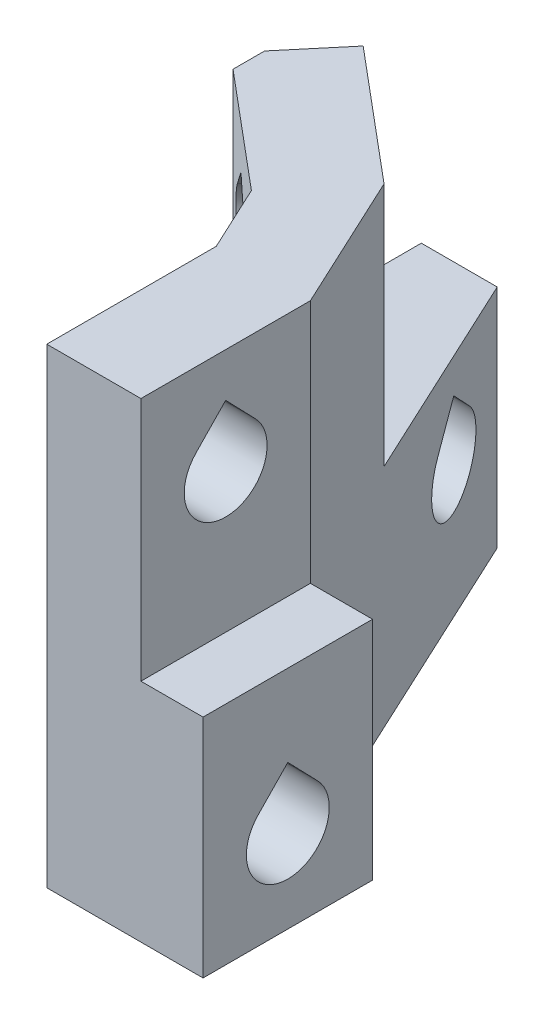
ISO-10303-21;
HEADER;
FILE_DESCRIPTION(('STEP AP214'),'2;1');
FILE_NAME('part.step','',(''),(''),'','','');
FILE_SCHEMA(('AUTOMOTIVE_DESIGN { 1 0 10303 214 1 1 1 1 }'));
ENDSEC;
DATA;
#1=APPLICATION_CONTEXT('core data for automotive mechanical design processes');
#2=APPLICATION_PROTOCOL_DEFINITION('international standard','automotive_design',2000,#1);
#3=PRODUCT_CONTEXT('',#1,'mechanical');
#4=PRODUCT('Part','Part','',(#3));
#5=PRODUCT_RELATED_PRODUCT_CATEGORY('part','',(#4));
#6=PRODUCT_DEFINITION_FORMATION('','',#4);
#7=PRODUCT_DEFINITION_CONTEXT('part definition',#1,'design');
#8=PRODUCT_DEFINITION('design','',#6,#7);
#9=PRODUCT_DEFINITION_SHAPE('','',#8);
#10=(LENGTH_UNIT() NAMED_UNIT(*) SI_UNIT(.MILLI.,.METRE.));
#11=(NAMED_UNIT(*) PLANE_ANGLE_UNIT() SI_UNIT($,.RADIAN.));
#12=(NAMED_UNIT(*) SI_UNIT($,.STERADIAN.) SOLID_ANGLE_UNIT());
#13=UNCERTAINTY_MEASURE_WITH_UNIT(LENGTH_MEASURE(1.E-05),#10,'distance_accuracy_value','');
#14=(GEOMETRIC_REPRESENTATION_CONTEXT(3) GLOBAL_UNCERTAINTY_ASSIGNED_CONTEXT((#13)) GLOBAL_UNIT_ASSIGNED_CONTEXT((#10,
#11,#12)) REPRESENTATION_CONTEXT('',''));
#15=CARTESIAN_POINT('',(0.,0.,0.));
#16=DIRECTION('',(0.,0.,1.));
#17=DIRECTION('',(1.,0.,0.));
#18=AXIS2_PLACEMENT_3D('',#15,#16,#17);
#19=CARTESIAN_POINT('',(-3.3,-5.,-12.5907135973796));
#20=DIRECTION('',(0.,-1.,0.));
#21=DIRECTION('',(0.,0.,-1.));
#22=AXIS2_PLACEMENT_3D('',#19,#20,#21);
#23=PLANE('',#22);
#24=DIRECTION('',(-0.642787609686539,0.,0.766044443118978));
#25=VECTOR('',#24,1.);
#26=CARTESIAN_POINT('',(-16.,-5.,-4.26779992139882));
#27=LINE('',#26,#25);
#28=CARTESIAN_POINT('',(-13.6118657587502,-5.,-7.11386748300547));
#29=VERTEX_POINT('',#28);
#30=CARTESIAN_POINT('',(-16.,-5.,-4.26779992139882));
#31=VERTEX_POINT('',#30);
#32=EDGE_CURVE('E391',#29,#31,#27,.T.);
#33=ORIENTED_EDGE('',*,*,#32,.F.);
#34=DIRECTION('',(-0.766044443118978,0.,-0.64278760968654));
#35=VECTOR('',#34,1.);
#36=CARTESIAN_POINT('',(-13.6118657587502,-5.,-7.11386748300547));
#37=LINE('',#36,#35);
#38=CARTESIAN_POINT('',(-6.71746577067944,-5.,-1.32877899582661));
#39=VERTEX_POINT('',#38);
#40=EDGE_CURVE('E387',#39,#29,#37,.T.);
#41=ORIENTED_EDGE('',*,*,#40,.F.);
#42=DIRECTION('',(0.422618261740698,0.,0.906307787036651));
#43=VECTOR('',#42,1.);
#44=CARTESIAN_POINT('',(-11.9689921210243,-5.,-12.5907135973796));
#45=LINE('',#44,#43);
#46=CARTESIAN_POINT('',(-11.9689921210243,-5.,-12.5907135973796));
#47=VERTEX_POINT('',#46);
#48=EDGE_CURVE('E416',#47,#39,#45,.T.);
#49=ORIENTED_EDGE('',*,*,#48,.F.);
#50=DIRECTION('',(1.,0.,0.));
#51=VECTOR('',#50,1.);
#52=CARTESIAN_POINT('',(-16.,-5.,-12.5907135973796));
#53=LINE('',#52,#51);
#54=CARTESIAN_POINT('',(-16.,-5.,-12.5907135973796));
#55=VERTEX_POINT('',#54);
#56=EDGE_CURVE('E367',#55,#47,#53,.T.);
#57=ORIENTED_EDGE('',*,*,#56,.F.);
#58=DIRECTION('',(0.,0.,-1.));
#59=VECTOR('',#58,1.);
#60=CARTESIAN_POINT('',(-16.,-5.,14.9999999999996));
#61=LINE('',#60,#59);
#62=EDGE_CURVE('E413',#31,#55,#61,.T.);
#63=ORIENTED_EDGE('',*,*,#62,.F.);
#64=EDGE_LOOP('',(#33,#41,#49,#57,#63));
#65=FACE_BOUND('',#64,.T.);
#66=ADVANCED_FACE('F30',(#65),#23,.F.);
#67=CARTESIAN_POINT('',(-16.,-5.,-12.5907135973796));
#68=DIRECTION('',(0.,0.,-1.));
#69=DIRECTION('',(-1.,0.,0.));
#70=AXIS2_PLACEMENT_3D('',#67,#68,#69);
#71=PLANE('',#70);
#72=DIRECTION('',(1.,0.,0.));
#73=VECTOR('',#72,1.);
#74=CARTESIAN_POINT('',(-16.,-17.,-12.5907135973796));
#75=LINE('',#74,#73);
#76=CARTESIAN_POINT('',(-16.,-17.,-12.5907135973796));
#77=VERTEX_POINT('',#76);
#78=CARTESIAN_POINT('',(-11.9689921210243,-17.,-12.5907135973796));
#79=VERTEX_POINT('',#78);
#80=EDGE_CURVE('E370',#77,#79,#75,.T.);
#81=ORIENTED_EDGE('',*,*,#80,.F.);
#82=DIRECTION('',(0.,-1.,0.));
#83=VECTOR('',#82,1.);
#84=CARTESIAN_POINT('',(-16.,-5.,-12.5907135973796));
#85=LINE('',#84,#83);
#86=EDGE_CURVE('E334',#55,#77,#85,.T.);
#87=ORIENTED_EDGE('',*,*,#86,.F.);
#88=ORIENTED_EDGE('',*,*,#56,.T.);
#89=DIRECTION('',(0.,-1.,0.));
#90=VECTOR('',#89,1.);
#91=CARTESIAN_POINT('',(-11.9689921210243,-5.,-12.5907135973796));
#92=LINE('',#91,#90);
#93=EDGE_CURVE('E404',#47,#79,#92,.T.);
#94=ORIENTED_EDGE('',*,*,#93,.T.);
#95=EDGE_LOOP('',(#81,#87,#88,#94));
#96=FACE_BOUND('',#95,.T.);
#97=ADVANCED_FACE('F481',(#96),#71,.T.);
#98=CARTESIAN_POINT('',(-16.,-5.,14.9999999999996));
#99=DIRECTION('',(-1.,0.,0.));
#100=DIRECTION('',(0.,0.,1.));
#101=AXIS2_PLACEMENT_3D('',#98,#99,#100);
#102=PLANE('',#101);
#103=DIRECTION('',(0.,0.71933980033865,-0.694658370458998));
#104=VECTOR('',#103,1.);
#105=CARTESIAN_POINT('',(-16.,-8.47175158499021,-6.68722321953723));
#106=LINE('',#105,#104);
#107=CARTESIAN_POINT('',(-16.,-8.47175158499021,-6.68722321953723));
#108=VERTEX_POINT('',#107);
#109=CARTESIAN_POINT('',(-16.,-6.83297561282341,-8.26977078028226));
#110=VERTEX_POINT('',#109);
#111=EDGE_CURVE('E219',#108,#110,#106,.T.);
#112=ORIENTED_EDGE('',*,*,#111,.F.);
#113=CARTESIAN_POINT('',(-16.,-10.,-8.26977078028226));
#114=DIRECTION('',(-1.,0.,0.));
#115=DIRECTION('',(0.,0.,1.));
#116=AXIS2_PLACEMENT_3D('',#113,#114,#115);
#117=CIRCLE('',#116,2.2);
#118=CARTESIAN_POINT('',(-16.,-8.47175158499021,-9.85231834102729));
#119=VERTEX_POINT('',#118);
#120=EDGE_CURVE('E204',#119,#108,#117,.T.);
#121=ORIENTED_EDGE('',*,*,#120,.F.);
#122=DIRECTION('',(0.,-0.71933980033865,-0.694658370458998));
#123=VECTOR('',#122,1.);
#124=CARTESIAN_POINT('',(-16.,-6.83297561282341,-8.26977078028226));
#125=LINE('',#124,#123);
#126=EDGE_CURVE('E215',#110,#119,#125,.T.);
#127=ORIENTED_EDGE('',*,*,#126,.F.);
#128=EDGE_LOOP('',(#112,#121,#127));
#129=FACE_BOUND('',#128,.T.);
#130=DIRECTION('',(0.,-1.,0.));
#131=VECTOR('',#130,1.);
#132=CARTESIAN_POINT('',(-16.,8.000025,-2.59071359737859));
#133=LINE('',#132,#131);
#134=CARTESIAN_POINT('',(-16.,8.,-2.59071359737859));
#135=VERTEX_POINT('',#134);
#136=CARTESIAN_POINT('',(-16.,-17.,-2.59071359737859));
#137=VERTEX_POINT('',#136);
#138=EDGE_CURVE('E295',#135,#137,#133,.T.);
#139=ORIENTED_EDGE('',*,*,#138,.F.);
#140=DIRECTION('',(0.,0.,1.));
#141=VECTOR('',#140,1.);
#142=CARTESIAN_POINT('',(-16.,8.,14.9999999999996));
#143=LINE('',#142,#141);
#144=CARTESIAN_POINT('',(-16.,8.,-4.26779992139882));
#145=VERTEX_POINT('',#144);
#146=EDGE_CURVE('E444',#145,#135,#143,.T.);
#147=ORIENTED_EDGE('',*,*,#146,.F.);
#148=DIRECTION('',(0.,-1.,0.));
#149=VECTOR('',#148,1.);
#150=CARTESIAN_POINT('',(-16.,8.,-4.26779992139882));
#151=LINE('',#150,#149);
#152=EDGE_CURVE('E431',#145,#31,#151,.T.);
#153=ORIENTED_EDGE('',*,*,#152,.T.);
#154=ORIENTED_EDGE('',*,*,#62,.T.);
#155=ORIENTED_EDGE('',*,*,#86,.T.);
#156=DIRECTION('',(0.,0.,-1.));
#157=VECTOR('',#156,1.);
#158=CARTESIAN_POINT('',(-16.,-17.,14.9999999999996));
#159=LINE('',#158,#157);
#160=EDGE_CURVE('E364',#137,#77,#159,.T.);
#161=ORIENTED_EDGE('',*,*,#160,.F.);
#162=EDGE_LOOP('',(#139,#147,#153,#154,#155,#161));
#163=FACE_BOUND('',#162,.T.);
#164=ADVANCED_FACE('F221',(#129,#163),#102,.T.);
#165=CARTESIAN_POINT('',(-3.3,-5.,14.9999999999996));
#166=DIRECTION('',(0.,0.,1.));
#167=DIRECTION('',(1.,0.,0.));
#168=AXIS2_PLACEMENT_3D('',#165,#166,#167);
#169=PLANE('',#168);
#170=DIRECTION('',(0.,-1.,0.));
#171=VECTOR('',#170,1.);
#172=CARTESIAN_POINT('',(-8.3,8.000025,14.9999999999996));
#173=LINE('',#172,#171);
#174=CARTESIAN_POINT('',(-8.3,8.,14.9999999999996));
#175=VERTEX_POINT('',#174);
#176=CARTESIAN_POINT('',(-8.3,-17.,14.9999999999996));
#177=VERTEX_POINT('',#176);
#178=EDGE_CURVE('E296',#175,#177,#173,.T.);
#179=ORIENTED_EDGE('',*,*,#178,.T.);
#180=DIRECTION('',(-1.,0.,0.));
#181=VECTOR('',#180,1.);
#182=CARTESIAN_POINT('',(-3.3,-17.,14.9999999999996));
#183=LINE('',#182,#181);
#184=CARTESIAN_POINT('',(0.,-17.,14.9999999999996));
#185=VERTEX_POINT('',#184);
#186=EDGE_CURVE('E361',#185,#177,#183,.T.);
#187=ORIENTED_EDGE('',*,*,#186,.F.);
#188=DIRECTION('',(0.,-1.,0.));
#189=VECTOR('',#188,1.);
#190=CARTESIAN_POINT('',(0.,-17.,14.9999999999996));
#191=LINE('',#190,#189);
#192=CARTESIAN_POINT('',(0.,-5.,14.9999999999996));
#193=VERTEX_POINT('',#192);
#194=EDGE_CURVE('E304',#193,#185,#191,.T.);
#195=ORIENTED_EDGE('',*,*,#194,.F.);
#196=DIRECTION('',(-1.,0.,0.));
#197=VECTOR('',#196,1.);
#198=CARTESIAN_POINT('',(0.,-5.,14.9999999999996));
#199=LINE('',#198,#197);
#200=CARTESIAN_POINT('',(-3.3,-5.,14.9999999999996));
#201=VERTEX_POINT('',#200);
#202=EDGE_CURVE('E385',#193,#201,#199,.T.);
#203=ORIENTED_EDGE('',*,*,#202,.T.);
#204=DIRECTION('',(0.,-1.,0.));
#205=VECTOR('',#204,1.);
#206=CARTESIAN_POINT('',(-3.3,-5.,14.9999999999996));
#207=LINE('',#206,#205);
#208=CARTESIAN_POINT('',(-3.3,8.,14.9999999999996));
#209=VERTEX_POINT('',#208);
#210=EDGE_CURVE('E376',#209,#201,#207,.T.);
#211=ORIENTED_EDGE('',*,*,#210,.F.);
#212=DIRECTION('',(1.,0.,0.));
#213=VECTOR('',#212,1.);
#214=CARTESIAN_POINT('',(-3.3,8.,14.9999999999996));
#215=LINE('',#214,#213);
#216=EDGE_CURVE('E441',#175,#209,#215,.T.);
#217=ORIENTED_EDGE('',*,*,#216,.F.);
#218=EDGE_LOOP('',(#179,#187,#195,#203,#211,#217));
#219=FACE_BOUND('',#218,.T.);
#220=ADVANCED_FACE('F467',(#219),#169,.T.);
#221=CARTESIAN_POINT('',(-3.3,-5.,5.99999999999999));
#222=DIRECTION('',(1.,0.,0.));
#223=DIRECTION('',(0.,0.,-1.));
#224=AXIS2_PLACEMENT_3D('',#221,#222,#223);
#225=PLANE('',#224);
#226=DIRECTION('',(0.,-0.719339800338651,0.694658370458997));
#227=VECTOR('',#226,1.);
#228=CARTESIAN_POINT('',(-3.3,2.39600466316838,13.6587870296473));
#229=LINE('',#228,#227);
#230=CARTESIAN_POINT('',(-3.3,5.66702438717678,10.4999999999998));
#231=VERTEX_POINT('',#230);
#232=CARTESIAN_POINT('',(-3.3,4.0282484150098,12.082547560745));
#233=VERTEX_POINT('',#232);
#234=EDGE_CURVE('E272',#231,#233,#229,.T.);
#235=ORIENTED_EDGE('',*,*,#234,.F.);
#236=DIRECTION('',(0.,0.719339800338728,0.694658370458918));
#237=VECTOR('',#236,1.);
#238=CARTESIAN_POINT('',(-3.3,-2.10125405841853,2.99826070551433));
#239=LINE('',#238,#237);
#240=CARTESIAN_POINT('',(-3.3,4.02824841500962,8.91745243925479));
#241=VERTEX_POINT('',#240);
#242=EDGE_CURVE('E263',#241,#231,#239,.T.);
#243=ORIENTED_EDGE('',*,*,#242,.F.);
#244=CARTESIAN_POINT('',(-3.3,2.5,10.5));
#245=DIRECTION('',(1.,0.,0.));
#246=DIRECTION('',(0.,0.,-1.));
#247=AXIS2_PLACEMENT_3D('',#244,#245,#246);
#248=CIRCLE('',#247,2.2);
#249=EDGE_CURVE('E269',#233,#241,#248,.T.);
#250=ORIENTED_EDGE('',*,*,#249,.F.);
#251=EDGE_LOOP('',(#235,#243,#250));
#252=FACE_BOUND('',#251,.T.);
#253=DIRECTION('',(0.,0.,1.));
#254=VECTOR('',#253,1.);
#255=CARTESIAN_POINT('',(-3.3,-5.,14.9999999999996));
#256=LINE('',#255,#254);
#257=CARTESIAN_POINT('',(-3.3,-5.,5.99999999999999));
#258=VERTEX_POINT('',#257);
#259=EDGE_CURVE('E299',#258,#201,#256,.T.);
#260=ORIENTED_EDGE('',*,*,#259,.F.);
#261=DIRECTION('',(0.,-1.,0.));
#262=VECTOR('',#261,1.);
#263=CARTESIAN_POINT('',(-3.3,-5.,5.99999999999999));
#264=LINE('',#263,#262);
#265=CARTESIAN_POINT('',(-3.3,8.,6.));
#266=VERTEX_POINT('',#265);
#267=EDGE_CURVE('E383',#266,#258,#264,.T.);
#268=ORIENTED_EDGE('',*,*,#267,.F.);
#269=DIRECTION('',(0.,0.,-1.));
#270=VECTOR('',#269,1.);
#271=CARTESIAN_POINT('',(-3.3,8.,6.));
#272=LINE('',#271,#270);
#273=EDGE_CURVE('E464',#209,#266,#272,.T.);
#274=ORIENTED_EDGE('',*,*,#273,.F.);
#275=ORIENTED_EDGE('',*,*,#210,.T.);
#276=EDGE_LOOP('',(#260,#268,#274,#275));
#277=FACE_BOUND('',#276,.T.);
#278=ADVANCED_FACE('F468',(#252,#277),#225,.T.);
#279=CARTESIAN_POINT('',(-11.9689921210243,-5.,-12.5907135973796));
#280=DIRECTION('',(0.906307787036651,0.,-0.422618261740698));
#281=DIRECTION('',(-0.422618261740698,0.,-0.906307787036651));
#282=AXIS2_PLACEMENT_3D('',#279,#280,#281);
#283=PLANE('',#282);
#284=DIRECTION('',(0.308160528121496,-0.684332677799278,0.66085238518443));
#285=VECTOR('',#284,1.);
#286=CARTESIAN_POINT('',(-11.4119429504304,-3.59554850664302,-11.3961177959768));
#287=LINE('',#286,#285);
#288=CARTESIAN_POINT('',(-9.95410339496202,-6.83297561282341,-8.26977078028226));
#289=VERTEX_POINT('',#288);
#290=CARTESIAN_POINT('',(-9.2161493479921,-8.47175158499021,-6.68722321953723));
#291=VERTEX_POINT('',#290);
#292=EDGE_CURVE('E346',#289,#291,#287,.T.);
#293=ORIENTED_EDGE('',*,*,#292,.F.);
#294=DIRECTION('',(0.308160528121496,0.684332677799278,0.66085238518443));
#295=VECTOR('',#294,1.);
#296=CARTESIAN_POINT('',(-10.6388513212511,-8.35359665040854,-9.73821744701371));
#297=LINE('',#296,#295);
#298=CARTESIAN_POINT('',(-10.6920574419319,-8.47175158499021,-9.85231834102729));
#299=VERTEX_POINT('',#298);
#300=EDGE_CURVE('E336',#299,#289,#297,.T.);
#301=ORIENTED_EDGE('',*,*,#300,.F.);
#302=CARTESIAN_POINT('',(-9.95410339496202,-10.,-8.26977078028226));
#303=DIRECTION('',(0.906307787036651,0.,-0.422618261740698));
#304=DIRECTION('',(-0.422618261740698,0.,-0.906307787036651));
#305=AXIS2_PLACEMENT_3D('',#302,#303,#304);
#306=ELLIPSE('',#305,2.42743142171748,2.2);
#307=EDGE_CURVE('E207',#291,#299,#306,.T.);
#308=ORIENTED_EDGE('',*,*,#307,.F.);
#309=EDGE_LOOP('',(#293,#301,#308));
#310=FACE_BOUND('',#309,.T.);
#311=DIRECTION('',(0.422618261740698,0.,0.906307787036651));
#312=VECTOR('',#311,1.);
#313=CARTESIAN_POINT('',(-11.9689921210243,-17.,-12.5907135973796));
#314=LINE('',#313,#312);
#315=CARTESIAN_POINT('',(-3.3,-17.,5.99999999999999));
#316=VERTEX_POINT('',#315);
#317=EDGE_CURVE('E365',#79,#316,#314,.T.);
#318=ORIENTED_EDGE('',*,*,#317,.F.);
#319=ORIENTED_EDGE('',*,*,#93,.F.);
#320=ORIENTED_EDGE('',*,*,#48,.T.);
#321=DIRECTION('',(0.,-1.,0.));
#322=VECTOR('',#321,1.);
#323=CARTESIAN_POINT('',(-6.71746577067944,8.,-1.32877899582662));
#324=LINE('',#323,#322);
#325=CARTESIAN_POINT('',(-6.71746577067944,8.,-1.32877899582662));
#326=VERTEX_POINT('',#325);
#327=EDGE_CURVE('E424',#326,#39,#324,.T.);
#328=ORIENTED_EDGE('',*,*,#327,.F.);
#329=DIRECTION('',(-0.422618261740698,0.,-0.906307787036651));
#330=VECTOR('',#329,1.);
#331=CARTESIAN_POINT('',(-6.71746577067944,8.,-1.32877899582662));
#332=LINE('',#331,#330);
#333=EDGE_CURVE('E409',#266,#326,#332,.T.);
#334=ORIENTED_EDGE('',*,*,#333,.F.);
#335=ORIENTED_EDGE('',*,*,#267,.T.);
#336=DIRECTION('',(0.,1.,0.));
#337=VECTOR('',#336,1.);
#338=CARTESIAN_POINT('',(-3.3,-5.,5.99999999999999));
#339=LINE('',#338,#337);
#340=EDGE_CURVE('E305',#316,#258,#339,.T.);
#341=ORIENTED_EDGE('',*,*,#340,.F.);
#342=EDGE_LOOP('',(#318,#319,#320,#328,#334,#335,#341));
#343=FACE_BOUND('',#342,.T.);
#344=ADVANCED_FACE('F402',(#310,#343),#283,.T.);
#345=CARTESIAN_POINT('',(-3.3,-17.,-12.5907135973796));
#346=DIRECTION('',(0.,-1.,0.));
#347=DIRECTION('',(0.,0.,-1.));
#348=AXIS2_PLACEMENT_3D('',#345,#346,#347);
#349=PLANE('',#348);
#350=DIRECTION('',(0.,0.,1.));
#351=VECTOR('',#350,1.);
#352=CARTESIAN_POINT('',(-8.3,-17.,3.87035356268647));
#353=LINE('',#352,#351);
#354=CARTESIAN_POINT('',(-8.3,-17.,6.));
#355=VERTEX_POINT('',#354);
#356=EDGE_CURVE('E292',#355,#177,#353,.T.);
#357=ORIENTED_EDGE('',*,*,#356,.F.);
#358=DIRECTION('',(0.422618261740694,0.,0.906307787036653));
#359=VECTOR('',#358,1.);
#360=CARTESIAN_POINT('',(-8.3,-17.,6.00000000000001));
#361=LINE('',#360,#359);
#362=CARTESIAN_POINT('',(-9.93140381911212,-17.,2.50144321976829));
#363=VERTEX_POINT('',#362);
#364=EDGE_CURVE('E38',#355,#363,#361,.F.);
#365=ORIENTED_EDGE('',*,*,#364,.T.);
#366=DIRECTION('',(0.766044443118978,0.,0.642787609686539));
#367=VECTOR('',#366,1.);
#368=CARTESIAN_POINT('',(-16.,-17.,-2.59071359737859));
#369=LINE('',#368,#367);
#370=EDGE_CURVE('E290',#137,#363,#369,.T.);
#371=ORIENTED_EDGE('',*,*,#370,.F.);
#372=ORIENTED_EDGE('',*,*,#160,.T.);
#373=ORIENTED_EDGE('',*,*,#80,.T.);
#374=ORIENTED_EDGE('',*,*,#317,.T.);
#375=DIRECTION('',(-1.,0.,0.));
#376=VECTOR('',#375,1.);
#377=CARTESIAN_POINT('',(0.,-17.,5.99999999999999));
#378=LINE('',#377,#376);
#379=CARTESIAN_POINT('',(0.,-17.,5.99999999999999));
#380=VERTEX_POINT('',#379);
#381=EDGE_CURVE('E315',#380,#316,#378,.T.);
#382=ORIENTED_EDGE('',*,*,#381,.F.);
#383=DIRECTION('',(0.,0.,-1.));
#384=VECTOR('',#383,1.);
#385=CARTESIAN_POINT('',(0.,-17.,5.99999999999999));
#386=LINE('',#385,#384);
#387=EDGE_CURVE('E308',#185,#380,#386,.T.);
#388=ORIENTED_EDGE('',*,*,#387,.F.);
#389=ORIENTED_EDGE('',*,*,#186,.T.);
#390=EDGE_LOOP('',(#357,#365,#371,#372,#373,#374,#382,#388,#389));
#391=FACE_BOUND('',#390,.T.);
#392=ADVANCED_FACE('F359',(#391),#349,.T.);
#393=CARTESIAN_POINT('',(-13.6118657587502,8.,-7.11386748300547));
#394=DIRECTION('',(-0.64278760968654,0.,0.766044443118978));
#395=DIRECTION('',(0.766044443118978,0.,0.64278760968654));
#396=AXIS2_PLACEMENT_3D('',#393,#394,#395);
#397=PLANE('',#396);
#398=CARTESIAN_POINT('',(-10.164692745414,2.5,-4.22134587891074));
#399=DIRECTION('',(-0.64278760968654,0.,0.766044443118978));
#400=DIRECTION('',(0.766044443118978,0.,0.64278760968654));
#401=AXIS2_PLACEMENT_3D('',#398,#399,#400);
#402=CIRCLE('',#401,2.2);
#403=CARTESIAN_POINT('',(-11.3769945102942,4.0282484150098,-5.2385878426973));
#404=VERTEX_POINT('',#403);
#405=CARTESIAN_POINT('',(-8.95239098053375,4.0282484150098,-3.20410391512417));
#406=VERTEX_POINT('',#405);
#407=EDGE_CURVE('E246',#404,#406,#402,.T.);
#408=ORIENTED_EDGE('',*,*,#407,.T.);
#409=DIRECTION('',(-0.5321391845562,0.71933980033865,-0.446517793496086));
#410=VECTOR('',#409,1.);
#411=CARTESIAN_POINT('',(-12.7211641068366,9.12283379206175,-6.36648005539575));
#412=LINE('',#411,#410);
#413=CARTESIAN_POINT('',(-10.164692745414,5.6670243871766,-4.22134587891074));
#414=VERTEX_POINT('',#413);
#415=EDGE_CURVE('E249',#406,#414,#412,.T.);
#416=ORIENTED_EDGE('',*,*,#415,.T.);
#417=DIRECTION('',(-0.532139184556199,-0.719339800338651,-0.446517793496086));
#418=VECTOR('',#417,1.);
#419=CARTESIAN_POINT('',(-10.9350897941157,4.62561026982159,-4.86778575833645));
#420=LINE('',#419,#418);
#421=EDGE_CURVE('E239',#414,#404,#420,.T.);
#422=ORIENTED_EDGE('',*,*,#421,.T.);
#423=EDGE_LOOP('',(#408,#416,#422));
#424=FACE_BOUND('',#423,.T.);
#425=ORIENTED_EDGE('',*,*,#40,.T.);
#426=DIRECTION('',(0.,-1.,0.));
#427=VECTOR('',#426,1.);
#428=CARTESIAN_POINT('',(-13.6118657587502,8.,-7.11386748300547));
#429=LINE('',#428,#427);
#430=CARTESIAN_POINT('',(-13.6118657587502,8.,-7.11386748300547));
#431=VERTEX_POINT('',#430);
#432=EDGE_CURVE('E426',#431,#29,#429,.T.);
#433=ORIENTED_EDGE('',*,*,#432,.F.);
#434=DIRECTION('',(-0.766044443118978,0.,-0.64278760968654));
#435=VECTOR('',#434,1.);
#436=CARTESIAN_POINT('',(-13.6118657587502,8.,-7.11386748300547));
#437=LINE('',#436,#435);
#438=EDGE_CURVE('E460',#326,#431,#437,.T.);
#439=ORIENTED_EDGE('',*,*,#438,.F.);
#440=ORIENTED_EDGE('',*,*,#327,.T.);
#441=EDGE_LOOP('',(#425,#433,#439,#440));
#442=FACE_BOUND('',#441,.T.);
#443=ADVANCED_FACE('F450',(#424,#442),#397,.F.);
#444=CARTESIAN_POINT('',(-16.,8.,-4.26779992139882));
#445=DIRECTION('',(0.766044443118978,0.,0.642787609686539));
#446=DIRECTION('',(0.642787609686539,0.,-0.766044443118978));
#447=AXIS2_PLACEMENT_3D('',#444,#445,#446);
#448=PLANE('',#447);
#449=ORIENTED_EDGE('',*,*,#32,.T.);
#450=ORIENTED_EDGE('',*,*,#152,.F.);
#451=DIRECTION('',(-0.642787609686539,0.,0.766044443118978));
#452=VECTOR('',#451,1.);
#453=CARTESIAN_POINT('',(-16.,8.,-4.26779992139882));
#454=LINE('',#453,#452);
#455=EDGE_CURVE('E456',#431,#145,#454,.T.);
#456=ORIENTED_EDGE('',*,*,#455,.F.);
#457=ORIENTED_EDGE('',*,*,#432,.T.);
#458=EDGE_LOOP('',(#449,#450,#456,#457));
#459=FACE_BOUND('',#458,.T.);
#460=ADVANCED_FACE('F453',(#459),#448,.F.);
#461=CARTESIAN_POINT('',(-16.,8.,14.9999999999996));
#462=DIRECTION('',(0.,-1.,0.));
#463=DIRECTION('',(0.,0.,-1.));
#464=AXIS2_PLACEMENT_3D('',#461,#462,#463);
#465=PLANE('',#464);
#466=DIRECTION('',(0.766044443118978,0.,0.642787609686539));
#467=VECTOR('',#466,1.);
#468=CARTESIAN_POINT('',(-7.33826443414233,8.,4.67734552128772));
#469=LINE('',#468,#467);
#470=CARTESIAN_POINT('',(-9.93140381911212,8.,2.50144321976829));
#471=VERTEX_POINT('',#470);
#472=EDGE_CURVE('E331',#135,#471,#469,.T.);
#473=ORIENTED_EDGE('',*,*,#472,.T.);
#474=DIRECTION('',(-0.422618261740694,0.,-0.906307787036653));
#475=VECTOR('',#474,1.);
#476=CARTESIAN_POINT('',(-6.22806770867156,8.,10.4432731375811));
#477=LINE('',#476,#475);
#478=CARTESIAN_POINT('',(-8.3,8.,6.));
#479=VERTEX_POINT('',#478);
#480=EDGE_CURVE('E11',#471,#479,#477,.F.);
#481=ORIENTED_EDGE('',*,*,#480,.T.);
#482=DIRECTION('',(0.,0.,1.));
#483=VECTOR('',#482,1.);
#484=CARTESIAN_POINT('',(-8.3,8.,14.9999999999996));
#485=LINE('',#484,#483);
#486=EDGE_CURVE('E333',#479,#175,#485,.T.);
#487=ORIENTED_EDGE('',*,*,#486,.T.);
#488=ORIENTED_EDGE('',*,*,#216,.T.);
#489=ORIENTED_EDGE('',*,*,#273,.T.);
#490=ORIENTED_EDGE('',*,*,#333,.T.);
#491=ORIENTED_EDGE('',*,*,#438,.T.);
#492=ORIENTED_EDGE('',*,*,#455,.T.);
#493=ORIENTED_EDGE('',*,*,#146,.T.);
#494=EDGE_LOOP('',(#473,#481,#487,#488,#489,#490,#491,#492,#493));
#495=FACE_BOUND('',#494,.T.);
#496=ADVANCED_FACE('F466',(#495),#465,.F.);
#497=CARTESIAN_POINT('',(0.,-5.,14.9999999999996));
#498=DIRECTION('',(0.,-1.,0.));
#499=DIRECTION('',(0.,0.,-1.));
#500=AXIS2_PLACEMENT_3D('',#497,#498,#499);
#501=PLANE('',#500);
#502=ORIENTED_EDGE('',*,*,#259,.T.);
#503=ORIENTED_EDGE('',*,*,#202,.F.);
#504=DIRECTION('',(0.,0.,1.));
#505=VECTOR('',#504,1.);
#506=CARTESIAN_POINT('',(0.,-5.,14.9999999999996));
#507=LINE('',#506,#505);
#508=CARTESIAN_POINT('',(0.,-5.,5.99999999999999));
#509=VERTEX_POINT('',#508);
#510=EDGE_CURVE('E301',#509,#193,#507,.T.);
#511=ORIENTED_EDGE('',*,*,#510,.F.);
#512=DIRECTION('',(-1.,0.,0.));
#513=VECTOR('',#512,1.);
#514=CARTESIAN_POINT('',(0.,-5.,5.99999999999999));
#515=LINE('',#514,#513);
#516=EDGE_CURVE('E312',#509,#258,#515,.T.);
#517=ORIENTED_EDGE('',*,*,#516,.T.);
#518=EDGE_LOOP('',(#502,#503,#511,#517));
#519=FACE_BOUND('',#518,.T.);
#520=ADVANCED_FACE('F679',(#519),#501,.F.);
#521=CARTESIAN_POINT('',(0.,-5.,5.99999999999999));
#522=DIRECTION('',(0.,0.,1.));
#523=DIRECTION('',(0.,-1.,0.));
#524=AXIS2_PLACEMENT_3D('',#521,#522,#523);
#525=PLANE('',#524);
#526=ORIENTED_EDGE('',*,*,#340,.T.);
#527=ORIENTED_EDGE('',*,*,#516,.F.);
#528=DIRECTION('',(0.,1.,0.));
#529=VECTOR('',#528,1.);
#530=CARTESIAN_POINT('',(0.,-5.,5.99999999999999));
#531=LINE('',#530,#529);
#532=EDGE_CURVE('E310',#380,#509,#531,.T.);
#533=ORIENTED_EDGE('',*,*,#532,.F.);
#534=ORIENTED_EDGE('',*,*,#381,.T.);
#535=EDGE_LOOP('',(#526,#527,#533,#534));
#536=FACE_BOUND('',#535,.T.);
#537=ADVANCED_FACE('F396',(#536),#525,.F.);
#538=CARTESIAN_POINT('',(0.,-5.,5.99999999999999));
#539=DIRECTION('',(-1.,0.,0.));
#540=DIRECTION('',(0.,0.,1.));
#541=AXIS2_PLACEMENT_3D('',#538,#539,#540);
#542=PLANE('',#541);
#543=CARTESIAN_POINT('',(0.,-12.5,10.5));
#544=DIRECTION('',(-1.,0.,0.));
#545=DIRECTION('',(0.,0.,1.));
#546=AXIS2_PLACEMENT_3D('',#543,#544,#545);
#547=CIRCLE('',#546,2.2);
#548=CARTESIAN_POINT('',(0.,-10.9717515849904,8.9174524392548));
#549=VERTEX_POINT('',#548);
#550=CARTESIAN_POINT('',(0.,-10.9717515849902,12.082547560745));
#551=VERTEX_POINT('',#550);
#552=EDGE_CURVE('E339',#549,#551,#547,.T.);
#553=ORIENTED_EDGE('',*,*,#552,.T.);
#554=DIRECTION('',(0.,0.719339800338651,-0.694658370458998));
#555=VECTOR('',#554,1.);
#556=CARTESIAN_POINT('',(0.,-4.84224911156289,6.16335582700402));
#557=LINE('',#556,#555);
#558=CARTESIAN_POINT('',(0.,-9.33297561282327,10.4999999999998));
#559=VERTEX_POINT('',#558);
#560=EDGE_CURVE('E293',#551,#559,#557,.T.);
#561=ORIENTED_EDGE('',*,*,#560,.T.);
#562=DIRECTION('',(0.,-0.719339800338728,-0.694658370458918));
#563=VECTOR('',#562,1.);
#564=CARTESIAN_POINT('',(0.,-9.33950783314815,10.4936919081575));
#565=LINE('',#564,#563);
#566=EDGE_CURVE('E289',#559,#549,#565,.T.);
#567=ORIENTED_EDGE('',*,*,#566,.T.);
#568=EDGE_LOOP('',(#553,#561,#567));
#569=FACE_BOUND('',#568,.T.);
#570=ORIENTED_EDGE('',*,*,#510,.T.);
#571=ORIENTED_EDGE('',*,*,#194,.T.);
#572=ORIENTED_EDGE('',*,*,#387,.T.);
#573=ORIENTED_EDGE('',*,*,#532,.T.);
#574=EDGE_LOOP('',(#570,#571,#572,#573));
#575=FACE_BOUND('',#574,.T.);
#576=ADVANCED_FACE('F515',(#569,#575),#542,.F.);
#577=CARTESIAN_POINT('',(-8.3,8.000025,3.87035356268647));
#578=DIRECTION('',(1.,0.,0.));
#579=DIRECTION('',(0.,0.,-1.));
#580=AXIS2_PLACEMENT_3D('',#577,#578,#579);
#581=PLANE('',#580);
#582=DIRECTION('',(0.,-0.719339800338728,-0.694658370458918));
#583=VECTOR('',#582,1.);
#584=CARTESIAN_POINT('',(-8.3,5.66702438717678,10.4999999999998));
#585=LINE('',#584,#583);
#586=CARTESIAN_POINT('',(-8.3,5.66702438717678,10.4999999999998));
#587=VERTEX_POINT('',#586);
#588=CARTESIAN_POINT('',(-8.3,4.02824841500962,8.91745243925479));
#589=VERTEX_POINT('',#588);
#590=EDGE_CURVE('E254',#587,#589,#585,.T.);
#591=ORIENTED_EDGE('',*,*,#590,.F.);
#592=DIRECTION('',(0.,0.719339800338651,-0.694658370458997));
#593=VECTOR('',#592,1.);
#594=CARTESIAN_POINT('',(-8.3,4.0282484150098,12.082547560745));
#595=LINE('',#594,#593);
#596=CARTESIAN_POINT('',(-8.3,4.0282484150098,12.082547560745));
#597=VERTEX_POINT('',#596);
#598=EDGE_CURVE('E252',#597,#587,#595,.T.);
#599=ORIENTED_EDGE('',*,*,#598,.F.);
#600=CARTESIAN_POINT('',(-8.3,2.5,10.5));
#601=DIRECTION('',(-1.,0.,0.));
#602=DIRECTION('',(0.,0.,1.));
#603=AXIS2_PLACEMENT_3D('',#600,#601,#602);
#604=CIRCLE('',#603,2.2);
#605=EDGE_CURVE('E257',#589,#597,#604,.T.);
#606=ORIENTED_EDGE('',*,*,#605,.F.);
#607=EDGE_LOOP('',(#591,#599,#606));
#608=FACE_BOUND('',#607,.T.);
#609=DIRECTION('',(0.,-0.719339800338728,-0.694658370458918));
#610=VECTOR('',#609,1.);
#611=CARTESIAN_POINT('',(-8.3,-9.33297561282327,10.4999999999998));
#612=LINE('',#611,#610);
#613=CARTESIAN_POINT('',(-8.3,-9.33297561282327,10.4999999999998));
#614=VERTEX_POINT('',#613);
#615=CARTESIAN_POINT('',(-8.3,-10.9717515849904,8.91745243925479));
#616=VERTEX_POINT('',#615);
#617=EDGE_CURVE('E276',#614,#616,#612,.T.);
#618=ORIENTED_EDGE('',*,*,#617,.F.);
#619=DIRECTION('',(0.,0.719339800338651,-0.694658370458998));
#620=VECTOR('',#619,1.);
#621=CARTESIAN_POINT('',(-8.3,-10.9717515849902,12.082547560745));
#622=LINE('',#621,#620);
#623=CARTESIAN_POINT('',(-8.3,-10.9717515849902,12.082547560745));
#624=VERTEX_POINT('',#623);
#625=EDGE_CURVE('E274',#624,#614,#622,.T.);
#626=ORIENTED_EDGE('',*,*,#625,.F.);
#627=CARTESIAN_POINT('',(-8.3,-12.5,10.5));
#628=DIRECTION('',(-1.,0.,0.));
#629=DIRECTION('',(0.,0.,1.));
#630=AXIS2_PLACEMENT_3D('',#627,#628,#629);
#631=CIRCLE('',#630,2.2);
#632=EDGE_CURVE('E279',#616,#624,#631,.T.);
#633=ORIENTED_EDGE('',*,*,#632,.F.);
#634=EDGE_LOOP('',(#618,#626,#633));
#635=FACE_BOUND('',#634,.T.);
#636=ORIENTED_EDGE('',*,*,#486,.F.);
#637=DIRECTION('',(0.,-1.,0.));
#638=VECTOR('',#637,1.);
#639=CARTESIAN_POINT('',(-8.3,-17.,6.));
#640=LINE('',#639,#638);
#641=EDGE_CURVE('E348',#479,#355,#640,.T.);
#642=ORIENTED_EDGE('',*,*,#641,.T.);
#643=ORIENTED_EDGE('',*,*,#356,.T.);
#644=ORIENTED_EDGE('',*,*,#178,.F.);
#645=EDGE_LOOP('',(#636,#642,#643,#644));
#646=FACE_BOUND('',#645,.T.);
#647=ADVANCED_FACE('F354',(#608,#635,#646),#581,.F.);
#648=CARTESIAN_POINT('',(-16.,8.000025,-2.59071359737859));
#649=DIRECTION('',(0.642787609686539,0.,-0.766044443118978));
#650=DIRECTION('',(-0.766044443118978,0.,-0.642787609686539));
#651=AXIS2_PLACEMENT_3D('',#648,#649,#650);
#652=PLANE('',#651);
#653=DIRECTION('',(-0.5321391845562,-0.719339800338651,-0.446517793496085));
#654=VECTOR('',#653,1.);
#655=CARTESIAN_POINT('',(-13.3786307938467,5.6670243871766,-0.391123663315853));
#656=LINE('',#655,#654);
#657=CARTESIAN_POINT('',(-13.3786307938467,5.6670243871766,-0.391123663315853));
#658=VERTEX_POINT('',#657);
#659=CARTESIAN_POINT('',(-14.5909325587269,4.0282484150098,-1.40836562710242));
#660=VERTEX_POINT('',#659);
#661=EDGE_CURVE('E230',#658,#660,#656,.T.);
#662=ORIENTED_EDGE('',*,*,#661,.F.);
#663=DIRECTION('',(-0.5321391845562,0.71933980033865,-0.446517793496086));
#664=VECTOR('',#663,1.);
#665=CARTESIAN_POINT('',(-12.1663290289664,4.0282484150098,0.626118300470713));
#666=LINE('',#665,#664);
#667=CARTESIAN_POINT('',(-12.1663290289664,4.0282484150098,0.626118300470713));
#668=VERTEX_POINT('',#667);
#669=EDGE_CURVE('E227',#668,#658,#666,.T.);
#670=ORIENTED_EDGE('',*,*,#669,.F.);
#671=CARTESIAN_POINT('',(-13.3786307938467,2.5,-0.39112366331585));
#672=DIRECTION('',(-0.642787609686539,0.,0.766044443118978));
#673=DIRECTION('',(0.766044443118978,0.,0.642787609686539));
#674=AXIS2_PLACEMENT_3D('',#671,#672,#673);
#675=CIRCLE('',#674,2.2);
#676=EDGE_CURVE('E233',#660,#668,#675,.T.);
#677=ORIENTED_EDGE('',*,*,#676,.F.);
#678=EDGE_LOOP('',(#662,#670,#677));
#679=FACE_BOUND('',#678,.T.);
#680=ORIENTED_EDGE('',*,*,#370,.T.);
#681=DIRECTION('',(0.,1.,0.));
#682=VECTOR('',#681,1.);
#683=CARTESIAN_POINT('',(-9.93140381911212,8.,2.50144321976829));
#684=LINE('',#683,#682);
#685=EDGE_CURVE('E45',#363,#471,#684,.T.);
#686=ORIENTED_EDGE('',*,*,#685,.T.);
#687=ORIENTED_EDGE('',*,*,#472,.F.);
#688=ORIENTED_EDGE('',*,*,#138,.T.);
#689=EDGE_LOOP('',(#680,#686,#687,#688));
#690=FACE_BOUND('',#689,.T.);
#691=ADVANCED_FACE('F533',(#679,#690),#652,.F.);
#692=CARTESIAN_POINT('',(2.49999999972494E-05,-10.9717515849902,12.082547560745));
#693=DIRECTION('',(0.,0.694658370458998,0.719339800338651));
#694=DIRECTION('',(0.,-0.719339800338651,0.694658370458998));
#695=AXIS2_PLACEMENT_3D('',#692,#693,#694);
#696=PLANE('',#695);
#697=DIRECTION('',(-1.,0.,0.));
#698=VECTOR('',#697,1.);
#699=CARTESIAN_POINT('',(2.49999999972494E-05,-10.9717515849902,12.082547560745));
#700=LINE('',#699,#698);
#701=EDGE_CURVE('E287',#551,#624,#700,.T.);
#702=ORIENTED_EDGE('',*,*,#701,.T.);
#703=ORIENTED_EDGE('',*,*,#625,.T.);
#704=DIRECTION('',(-1.,0.,0.));
#705=VECTOR('',#704,1.);
#706=CARTESIAN_POINT('',(2.49999999972494E-05,-9.33297561282327,10.4999999999998));
#707=LINE('',#706,#705);
#708=EDGE_CURVE('E282',#559,#614,#707,.T.);
#709=ORIENTED_EDGE('',*,*,#708,.F.);
#710=ORIENTED_EDGE('',*,*,#560,.F.);
#711=EDGE_LOOP('',(#702,#703,#709,#710));
#712=FACE_BOUND('',#711,.T.);
#713=ADVANCED_FACE('F527',(#712),#696,.F.);
#714=CARTESIAN_POINT('',(2.49999999972494E-05,-12.5,10.5));
#715=DIRECTION('',(-1.,0.,0.));
#716=DIRECTION('',(0.,0.,1.));
#717=AXIS2_PLACEMENT_3D('',#714,#715,#716);
#718=CYLINDRICAL_SURFACE('',#717,2.2);
#719=DIRECTION('',(-1.,0.,0.));
#720=VECTOR('',#719,1.);
#721=CARTESIAN_POINT('',(2.49999999972494E-05,-10.9717515849904,8.9174524392548));
#722=LINE('',#721,#720);
#723=EDGE_CURVE('E285',#549,#616,#722,.T.);
#724=ORIENTED_EDGE('',*,*,#723,.T.);
#725=ORIENTED_EDGE('',*,*,#632,.T.);
#726=ORIENTED_EDGE('',*,*,#701,.F.);
#727=ORIENTED_EDGE('',*,*,#552,.F.);
#728=EDGE_LOOP('',(#724,#725,#726,#727));
#729=FACE_BOUND('',#728,.T.);
#730=ADVANCED_FACE('F532',(#729),#718,.F.);
#731=CARTESIAN_POINT('',(2.49999999972494E-05,-9.33297561282327,10.4999999999998));
#732=DIRECTION('',(0.,0.694658370458918,-0.719339800338728));
#733=DIRECTION('',(0.,0.719339800338728,0.694658370458918));
#734=AXIS2_PLACEMENT_3D('',#731,#732,#733);
#735=PLANE('',#734);
#736=ORIENTED_EDGE('',*,*,#708,.T.);
#737=ORIENTED_EDGE('',*,*,#617,.T.);
#738=ORIENTED_EDGE('',*,*,#723,.F.);
#739=ORIENTED_EDGE('',*,*,#566,.F.);
#740=EDGE_LOOP('',(#736,#737,#738,#739));
#741=FACE_BOUND('',#740,.T.);
#742=ADVANCED_FACE('F545',(#741),#735,.F.);
#743=CARTESIAN_POINT('',(2.49999999972494E-05,4.0282484150098,12.082547560745));
#744=DIRECTION('',(0.,0.694658370458997,0.719339800338651));
#745=DIRECTION('',(0.,-0.719339800338651,0.694658370458997));
#746=AXIS2_PLACEMENT_3D('',#743,#744,#745);
#747=PLANE('',#746);
#748=ORIENTED_EDGE('',*,*,#234,.T.);
#749=DIRECTION('',(-1.,0.,0.));
#750=VECTOR('',#749,1.);
#751=CARTESIAN_POINT('',(2.49999999972494E-05,4.0282484150098,12.082547560745));
#752=LINE('',#751,#750);
#753=EDGE_CURVE('E261',#233,#597,#752,.T.);
#754=ORIENTED_EDGE('',*,*,#753,.T.);
#755=ORIENTED_EDGE('',*,*,#598,.T.);
#756=DIRECTION('',(-1.,0.,0.));
#757=VECTOR('',#756,1.);
#758=CARTESIAN_POINT('',(2.49999999972494E-05,5.66702438717678,10.4999999999998));
#759=LINE('',#758,#757);
#760=EDGE_CURVE('E260',#231,#587,#759,.T.);
#761=ORIENTED_EDGE('',*,*,#760,.F.);
#762=EDGE_LOOP('',(#748,#754,#755,#761));
#763=FACE_BOUND('',#762,.T.);
#764=ADVANCED_FACE('F554',(#763),#747,.F.);
#765=CARTESIAN_POINT('',(2.49999999972494E-05,2.5,10.5));
#766=DIRECTION('',(-1.,0.,0.));
#767=DIRECTION('',(0.,0.,1.));
#768=AXIS2_PLACEMENT_3D('',#765,#766,#767);
#769=CYLINDRICAL_SURFACE('',#768,2.2);
#770=ORIENTED_EDGE('',*,*,#249,.T.);
#771=DIRECTION('',(-1.,0.,0.));
#772=VECTOR('',#771,1.);
#773=CARTESIAN_POINT('',(2.49999999972494E-05,4.02824841500962,8.91745243925479));
#774=LINE('',#773,#772);
#775=EDGE_CURVE('E264',#241,#589,#774,.T.);
#776=ORIENTED_EDGE('',*,*,#775,.T.);
#777=ORIENTED_EDGE('',*,*,#605,.T.);
#778=ORIENTED_EDGE('',*,*,#753,.F.);
#779=EDGE_LOOP('',(#770,#776,#777,#778));
#780=FACE_BOUND('',#779,.T.);
#781=ADVANCED_FACE('F571',(#780),#769,.F.);
#782=CARTESIAN_POINT('',(2.49999999972494E-05,5.66702438717678,10.4999999999998));
#783=DIRECTION('',(0.,0.694658370458918,-0.719339800338728));
#784=DIRECTION('',(0.,0.719339800338728,0.694658370458918));
#785=AXIS2_PLACEMENT_3D('',#782,#783,#784);
#786=PLANE('',#785);
#787=ORIENTED_EDGE('',*,*,#242,.T.);
#788=ORIENTED_EDGE('',*,*,#760,.T.);
#789=ORIENTED_EDGE('',*,*,#590,.T.);
#790=ORIENTED_EDGE('',*,*,#775,.F.);
#791=EDGE_LOOP('',(#787,#788,#789,#790));
#792=FACE_BOUND('',#791,.T.);
#793=ADVANCED_FACE('F581',(#792),#786,.F.);
#794=CARTESIAN_POINT('',(-0.63145304574567,4.0282484150098,-13.1206115926613));
#795=DIRECTION('',(0.551046256763738,0.694658370458998,0.462382710812073));
#796=DIRECTION('',(-0.783437107222808,0.621471076580687,0.));
#797=AXIS2_PLACEMENT_3D('',#794,#795,#796);
#798=PLANE('',#797);
#799=DIRECTION('',(-0.642787609686539,0.,0.766044443118978));
#800=VECTOR('',#799,1.);
#801=CARTESIAN_POINT('',(-0.63145304574567,4.0282484150098,-13.1206115926613));
#802=LINE('',#801,#800);
#803=EDGE_CURVE('E237',#406,#668,#802,.T.);
#804=ORIENTED_EDGE('',*,*,#803,.T.);
#805=ORIENTED_EDGE('',*,*,#669,.T.);
#806=DIRECTION('',(-0.642787609686539,0.,0.766044443118978));
#807=VECTOR('',#806,1.);
#808=CARTESIAN_POINT('',(-1.8437548106259,5.6670243871766,-14.1378535564479));
#809=LINE('',#808,#807);
#810=EDGE_CURVE('E236',#414,#658,#809,.T.);
#811=ORIENTED_EDGE('',*,*,#810,.F.);
#812=ORIENTED_EDGE('',*,*,#415,.F.);
#813=EDGE_LOOP('',(#804,#805,#811,#812));
#814=FACE_BOUND('',#813,.T.);
#815=ADVANCED_FACE('F591',(#814),#798,.F.);
#816=CARTESIAN_POINT('',(-1.8437548106259,2.5,-14.1378535564479));
#817=DIRECTION('',(-0.642787609686539,0.,0.766044443118978));
#818=DIRECTION('',(0.766044443118978,0.,0.642787609686539));
#819=AXIS2_PLACEMENT_3D('',#816,#817,#818);
#820=CYLINDRICAL_SURFACE('',#819,2.2);
#821=DIRECTION('',(-0.642787609686539,0.,0.766044443118978));
#822=VECTOR('',#821,1.);
#823=CARTESIAN_POINT('',(-3.05605657550612,4.0282484150098,-15.1550955202344));
#824=LINE('',#823,#822);
#825=EDGE_CURVE('E240',#404,#660,#824,.T.);
#826=ORIENTED_EDGE('',*,*,#825,.T.);
#827=ORIENTED_EDGE('',*,*,#676,.T.);
#828=ORIENTED_EDGE('',*,*,#803,.F.);
#829=ORIENTED_EDGE('',*,*,#407,.F.);
#830=EDGE_LOOP('',(#826,#827,#828,#829));
#831=FACE_BOUND('',#830,.T.);
#832=ADVANCED_FACE('F611',(#831),#820,.F.);
#833=CARTESIAN_POINT('',(-1.8437548106259,5.6670243871766,-14.1378535564479));
#834=DIRECTION('',(-0.551046256763739,0.694658370458998,-0.462382710812074));
#835=DIRECTION('',(-0.783437107222807,-0.621471076580688,0.));
#836=AXIS2_PLACEMENT_3D('',#833,#834,#835);
#837=PLANE('',#836);
#838=ORIENTED_EDGE('',*,*,#810,.T.);
#839=ORIENTED_EDGE('',*,*,#661,.T.);
#840=ORIENTED_EDGE('',*,*,#825,.F.);
#841=ORIENTED_EDGE('',*,*,#421,.F.);
#842=EDGE_LOOP('',(#838,#839,#840,#841));
#843=FACE_BOUND('',#842,.T.);
#844=ADVANCED_FACE('F620',(#843),#837,.F.);
#845=CARTESIAN_POINT('',(2.49999999972494E-05,-8.47175158499021,-6.68722321953723));
#846=DIRECTION('',(0.,0.694658370458998,0.71933980033865));
#847=DIRECTION('',(0.,-0.71933980033865,0.694658370458998));
#848=AXIS2_PLACEMENT_3D('',#845,#846,#847);
#849=PLANE('',#848);
#850=ORIENTED_EDGE('',*,*,#292,.T.);
#851=DIRECTION('',(-1.,0.,0.));
#852=VECTOR('',#851,1.);
#853=CARTESIAN_POINT('',(2.49999999972494E-05,-8.47175158499021,-6.68722321953723));
#854=LINE('',#853,#852);
#855=EDGE_CURVE('E210',#291,#108,#854,.T.);
#856=ORIENTED_EDGE('',*,*,#855,.T.);
#857=ORIENTED_EDGE('',*,*,#111,.T.);
#858=DIRECTION('',(-1.,0.,0.));
#859=VECTOR('',#858,1.);
#860=CARTESIAN_POINT('',(2.49999999972494E-05,-6.83297561282341,-8.26977078028226));
#861=LINE('',#860,#859);
#862=EDGE_CURVE('E211',#289,#110,#861,.T.);
#863=ORIENTED_EDGE('',*,*,#862,.F.);
#864=EDGE_LOOP('',(#850,#856,#857,#863));
#865=FACE_BOUND('',#864,.T.);
#866=ADVANCED_FACE('F629',(#865),#849,.F.);
#867=CARTESIAN_POINT('',(2.49999999972494E-05,-10.,-8.26977078028226));
#868=DIRECTION('',(-1.,0.,0.));
#869=DIRECTION('',(0.,0.,1.));
#870=AXIS2_PLACEMENT_3D('',#867,#868,#869);
#871=CYLINDRICAL_SURFACE('',#870,2.2);
#872=ORIENTED_EDGE('',*,*,#307,.T.);
#873=DIRECTION('',(-1.,0.,0.));
#874=VECTOR('',#873,1.);
#875=CARTESIAN_POINT('',(2.49999999972494E-05,-8.47175158499021,-9.85231834102729));
#876=LINE('',#875,#874);
#877=EDGE_CURVE('E199',#299,#119,#876,.T.);
#878=ORIENTED_EDGE('',*,*,#877,.T.);
#879=ORIENTED_EDGE('',*,*,#120,.T.);
#880=ORIENTED_EDGE('',*,*,#855,.F.);
#881=EDGE_LOOP('',(#872,#878,#879,#880));
#882=FACE_BOUND('',#881,.T.);
#883=ADVANCED_FACE('F201',(#882),#871,.F.);
#884=CARTESIAN_POINT('',(2.49999999972494E-05,-6.83297561282341,-8.26977078028226));
#885=DIRECTION('',(0.,0.694658370458998,-0.71933980033865));
#886=DIRECTION('',(0.,0.71933980033865,0.694658370458998));
#887=AXIS2_PLACEMENT_3D('',#884,#885,#886);
#888=PLANE('',#887);
#889=ORIENTED_EDGE('',*,*,#300,.T.);
#890=ORIENTED_EDGE('',*,*,#862,.T.);
#891=ORIENTED_EDGE('',*,*,#126,.T.);
#892=ORIENTED_EDGE('',*,*,#877,.F.);
#893=EDGE_LOOP('',(#889,#890,#891,#892));
#894=FACE_BOUND('',#893,.T.);
#895=ADVANCED_FACE('F216',(#894),#888,.F.);
#896=CARTESIAN_POINT('',(-8.3,8.000025,6.00000000000001));
#897=DIRECTION('',(-0.906307787036653,0.,0.422618261740694));
#898=DIRECTION('',(0.422618261740694,0.,0.906307787036653));
#899=AXIS2_PLACEMENT_3D('',#896,#897,#898);
#900=PLANE('',#899);
#901=ORIENTED_EDGE('',*,*,#480,.F.);
#902=ORIENTED_EDGE('',*,*,#685,.F.);
#903=ORIENTED_EDGE('',*,*,#364,.F.);
#904=ORIENTED_EDGE('',*,*,#641,.F.);
#905=EDGE_LOOP('',(#901,#902,#903,#904));
#906=FACE_BOUND('',#905,.T.);
#907=ADVANCED_FACE('F32',(#906),#900,.T.);
#908=CLOSED_SHELL('',(#66,#97,#164,#220,#278,#344,#392,#443,#460,#496,#520,#537,#576,#647,#691,
#713,#730,#742,#764,#781,#793,#815,#832,#844,#866,#883,#895,#907));
#909=MANIFOLD_SOLID_BREP('B2',#908);
#910=ADVANCED_BREP_SHAPE_REPRESENTATION('',(#18,#909),#14);
#911=SHAPE_DEFINITION_REPRESENTATION(#9,#910);
ENDSEC;
END-ISO-10303-21;
